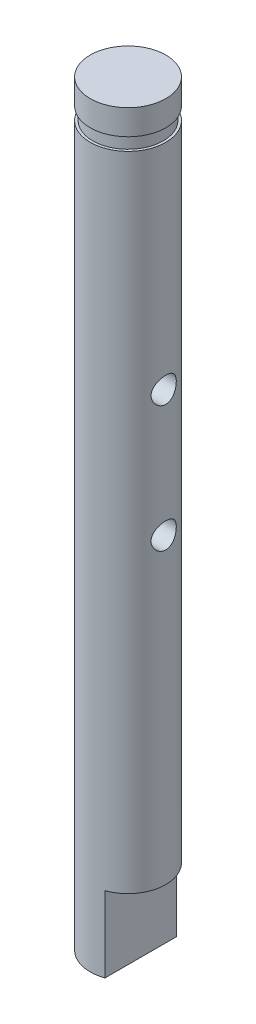
ISO-10303-21;
HEADER;
FILE_DESCRIPTION(('STEP AP214'),'2;1');
FILE_NAME('part.step','',(''),(''),'','','');
FILE_SCHEMA(('AUTOMOTIVE_DESIGN { 1 0 10303 214 1 1 1 1 }'));
ENDSEC;
DATA;
#1=APPLICATION_CONTEXT('core data for automotive mechanical design processes');
#2=APPLICATION_PROTOCOL_DEFINITION('international standard','automotive_design',2000,#1);
#3=PRODUCT_CONTEXT('',#1,'mechanical');
#4=PRODUCT('Part','Part','',(#3));
#5=PRODUCT_RELATED_PRODUCT_CATEGORY('part','',(#4));
#6=PRODUCT_DEFINITION_FORMATION('','',#4);
#7=PRODUCT_DEFINITION_CONTEXT('part definition',#1,'design');
#8=PRODUCT_DEFINITION('design','',#6,#7);
#9=PRODUCT_DEFINITION_SHAPE('','',#8);
#10=(LENGTH_UNIT() NAMED_UNIT(*) SI_UNIT(.MILLI.,.METRE.));
#11=(NAMED_UNIT(*) PLANE_ANGLE_UNIT() SI_UNIT($,.RADIAN.));
#12=(NAMED_UNIT(*) SI_UNIT($,.STERADIAN.) SOLID_ANGLE_UNIT());
#13=UNCERTAINTY_MEASURE_WITH_UNIT(LENGTH_MEASURE(1.E-05),#10,'distance_accuracy_value','');
#14=(GEOMETRIC_REPRESENTATION_CONTEXT(3) GLOBAL_UNCERTAINTY_ASSIGNED_CONTEXT((#13)) GLOBAL_UNIT_ASSIGNED_CONTEXT((#10,
#11,#12)) REPRESENTATION_CONTEXT('',''));
#15=CARTESIAN_POINT('',(0.,0.,0.));
#16=DIRECTION('',(0.,0.,1.));
#17=DIRECTION('',(1.,0.,0.));
#18=AXIS2_PLACEMENT_3D('',#15,#16,#17);
#19=CARTESIAN_POINT('',(0.,0.,0.));
#20=DIRECTION('',(0.,1.,0.));
#21=DIRECTION('',(0.,0.,1.));
#22=AXIS2_PLACEMENT_3D('',#19,#20,#21);
#23=PLANE('',#22);
#24=DIRECTION('',(0.,0.,-1.));
#25=VECTOR('',#24,1.);
#26=CARTESIAN_POINT('',(1.,0.,2.82842712474619));
#27=LINE('',#26,#25);
#28=CARTESIAN_POINT('',(1.,0.,2.82842712474619));
#29=VERTEX_POINT('',#28);
#30=CARTESIAN_POINT('',(1.,0.,-2.82842712474619));
#31=VERTEX_POINT('',#30);
#32=EDGE_CURVE('E76',#29,#31,#27,.T.);
#33=ORIENTED_EDGE('',*,*,#32,.F.);
#34=CARTESIAN_POINT('',(0.,0.,0.));
#35=DIRECTION('',(0.,1.,0.));
#36=DIRECTION('',(0.,0.,1.));
#37=AXIS2_PLACEMENT_3D('',#34,#35,#36);
#38=CIRCLE('',#37,3.);
#39=EDGE_CURVE('E86',#31,#29,#38,.T.);
#40=ORIENTED_EDGE('',*,*,#39,.F.);
#41=EDGE_LOOP('',(#33,#40));
#42=FACE_BOUND('',#41,.T.);
#43=ADVANCED_FACE('F42',(#42),#23,.F.);
#44=CARTESIAN_POINT('',(0.,60.,0.));
#45=DIRECTION('',(0.,-1.,0.));
#46=DIRECTION('',(0.,0.,-1.));
#47=AXIS2_PLACEMENT_3D('',#44,#45,#46);
#48=CYLINDRICAL_SURFACE('',#47,3.);
#49=CARTESIAN_POINT('',(0.,6.,0.));
#50=DIRECTION('',(0.,-1.,0.));
#51=DIRECTION('',(0.,0.,-1.));
#52=AXIS2_PLACEMENT_3D('',#49,#50,#51);
#53=CIRCLE('',#52,3.);
#54=CARTESIAN_POINT('',(1.,6.,-2.82842712474619));
#55=VERTEX_POINT('',#54);
#56=CARTESIAN_POINT('',(1.,6.,2.82842712474619));
#57=VERTEX_POINT('',#56);
#58=EDGE_CURVE('E68',#55,#57,#53,.T.);
#59=ORIENTED_EDGE('',*,*,#58,.F.);
#60=DIRECTION('',(0.,-1.,0.));
#61=VECTOR('',#60,1.);
#62=CARTESIAN_POINT('',(1.,6.,-2.82842712474619));
#63=LINE('',#62,#61);
#64=EDGE_CURVE('E83',#55,#31,#63,.T.);
#65=ORIENTED_EDGE('',*,*,#64,.T.);
#66=ORIENTED_EDGE('',*,*,#39,.T.);
#67=DIRECTION('',(0.,-1.,0.));
#68=VECTOR('',#67,1.);
#69=CARTESIAN_POINT('',(1.,6.,2.82842712474619));
#70=LINE('',#69,#68);
#71=EDGE_CURVE('E77',#57,#29,#70,.T.);
#72=ORIENTED_EDGE('',*,*,#71,.F.);
#73=EDGE_LOOP('',(#59,#65,#66,#72));
#74=FACE_BOUND('',#73,.T.);
#75=CARTESIAN_POINT('',(-3.,39.,0.));
#76=CARTESIAN_POINT('',(-3.00000015300943,38.9999997462684,-0.0545633628867233));
#77=CARTESIAN_POINT('',(-2.99849769507545,39.0044802661272,-0.10912519453855));
#78=CARTESIAN_POINT('',(-2.99265210203281,39.0222291088172,-0.216641760872972));
#79=CARTESIAN_POINT('',(-2.98830867202153,39.0354983439489,-0.269596328118819));
#80=CARTESIAN_POINT('',(-2.97725307906443,39.070319243384,-0.372332789501776));
#81=CARTESIAN_POINT('',(-2.97054487730853,39.0918570624593,-0.422119825886033));
#82=CARTESIAN_POINT('',(-2.95544445717342,39.1425411728383,-0.517374936805323));
#83=CARTESIAN_POINT('',(-2.94705190667778,39.1716889650026,-0.562842156958705));
#84=CARTESIAN_POINT('',(-2.92914094443005,39.2378258048587,-0.649741675022267));
#85=CARTESIAN_POINT('',(-2.91959556463785,39.2750312342605,-0.69100370029831));
#86=CARTESIAN_POINT('',(-2.90060314783121,39.3557671547066,-0.766832692702085));
#87=CARTESIAN_POINT('',(-2.89115613290549,39.3992990349285,-0.801398185489463));
#88=CARTESIAN_POINT('',(-2.87313332477274,39.4929851151965,-0.863824942227859));
#89=CARTESIAN_POINT('',(-2.86459039275688,39.5432937397321,-0.891464858221032));
#90=CARTESIAN_POINT('',(-2.84975305418601,39.6481760944585,-0.937818873877723));
#91=CARTESIAN_POINT('',(-2.84345796160746,39.7027485171627,-0.956535697386767));
#92=CARTESIAN_POINT('',(-2.83411303269377,39.8126732214967,-0.983873461509167));
#93=CARTESIAN_POINT('',(-2.83096095769611,39.8679372084891,-0.992813448271772));
#94=CARTESIAN_POINT('',(-2.82795656629508,39.9792637541559,-1.00134112333448));
#95=CARTESIAN_POINT('',(-2.8281032302273,40.0353260607092,-1.00093170160472));
#96=CARTESIAN_POINT('',(-2.8315901500818,40.143936630444,-0.99101990370342));
#97=CARTESIAN_POINT('',(-2.83478415867533,40.196528402919,-0.981933913166996));
#98=CARTESIAN_POINT('',(-2.84376657724551,40.2993934196068,-0.955606162849418));
#99=CARTESIAN_POINT('',(-2.84955529784108,40.3496663854351,-0.938363426591872));
#100=CARTESIAN_POINT('',(-2.86317911131249,40.4474127495915,-0.895939058060213));
#101=CARTESIAN_POINT('',(-2.87104565793117,40.4948280254695,-0.870634048707265));
#102=CARTESIAN_POINT('',(-2.88792558575726,40.5848709082797,-0.812889106303141));
#103=CARTESIAN_POINT('',(-2.89693929790464,40.6274971269334,-0.780447112364007));
#104=CARTESIAN_POINT('',(-2.91567329167741,40.7090915981608,-0.707349332682237));
#105=CARTESIAN_POINT('',(-2.92540589354843,40.7477526945091,-0.66635315007631));
#106=CARTESIAN_POINT('',(-2.94406938387037,40.8177312666634,-0.578339569970061));
#107=CARTESIAN_POINT('',(-2.95300019538067,40.8490480381645,-0.531321595660813));
#108=CARTESIAN_POINT('',(-2.96917107937794,40.9036963002351,-0.431947613046268));
#109=CARTESIAN_POINT('',(-2.97639350008039,40.9269454913407,-0.379543276416337));
#110=CARTESIAN_POINT('',(-2.98820567144435,40.9642031739557,-0.271269083364509));
#111=CARTESIAN_POINT('',(-2.99279633654879,40.9782148754234,-0.215400438154955));
#112=CARTESIAN_POINT('',(-2.99867627071441,40.9960556660224,-0.104383829529304));
#113=CARTESIAN_POINT('',(-3.00010001833731,41.0002998091727,-0.0493095998648457));
#114=CARTESIAN_POINT('',(-2.99988902694825,40.9996673264015,0.0607750699602366));
#115=CARTESIAN_POINT('',(-2.99825480419352,40.9947922400201,0.115785519319648));
#116=CARTESIAN_POINT('',(-2.99220024717114,40.976388092264,0.222519866304259));
#117=CARTESIAN_POINT('',(-2.98786198711228,40.9631137939505,0.274292806834855));
#118=CARTESIAN_POINT('',(-2.97691846830034,40.9286065555333,0.37485595857956));
#119=CARTESIAN_POINT('',(-2.97031292046541,40.9073726005323,0.423645788508559));
#120=CARTESIAN_POINT('',(-2.95528931287427,40.8569295681591,0.518288296393323));
#121=CARTESIAN_POINT('',(-2.94682814756305,40.8275254067164,0.564029959217331));
#122=CARTESIAN_POINT('',(-2.92905253915743,40.7618058499869,0.650064830135405));
#123=CARTESIAN_POINT('',(-2.91973783591888,40.7254883439698,0.690356367794895));
#124=CARTESIAN_POINT('',(-2.90076847982472,40.6450212489917,0.766252507807013));
#125=CARTESIAN_POINT('',(-2.89111761095155,40.6005907730667,0.801560969248491));
#126=CARTESIAN_POINT('',(-2.87299973286981,40.5062284321955,0.864257522320853));
#127=CARTESIAN_POINT('',(-2.8645327335312,40.4562965213898,0.891645547920842));
#128=CARTESIAN_POINT('',(-2.84982391820308,40.3523269846934,0.93759693042336));
#129=CARTESIAN_POINT('',(-2.84357760900632,40.2982979207572,0.956178132197766));
#130=CARTESIAN_POINT('',(-2.83410832399133,40.1876213498758,0.983894666792163));
#131=CARTESIAN_POINT('',(-2.83088398622698,40.1309750345669,0.993034254961245));
#132=CARTESIAN_POINT('',(-2.82797858875071,40.0198029039868,1.00127628247038));
#133=CARTESIAN_POINT('',(-2.82812400344299,39.9653176597483,1.00087025731093));
#134=CARTESIAN_POINT('',(-2.8315126992356,39.8572349251003,0.99124229345488));
#135=CARTESIAN_POINT('',(-2.83475579595884,39.8036373820471,0.982020879458889));
#136=CARTESIAN_POINT('',(-2.84384524278943,39.6998643369873,0.955371813126983));
#137=CARTESIAN_POINT('',(-2.84964098015514,39.6496431749928,0.938103346014883));
#138=CARTESIAN_POINT('',(-2.86316398825434,39.5527725930645,0.895979365760383));
#139=CARTESIAN_POINT('',(-2.87089168765297,39.5061239688127,0.871122168553977));
#140=CARTESIAN_POINT('',(-2.8878282922406,39.4155163300763,0.813260692583244));
#141=CARTESIAN_POINT('',(-2.89708711641604,39.3717634981014,0.779948242764529));
#142=CARTESIAN_POINT('',(-2.91583356283786,39.290310186616,0.706642883135695));
#143=CARTESIAN_POINT('',(-2.92532124912518,39.252611424312,0.666648084451492));
#144=CARTESIAN_POINT('',(-2.94390030525393,39.1828555877108,0.579241556920673));
#145=CARTESIAN_POINT('',(-2.95296181801216,39.151075652249,0.531601513499725));
#146=CARTESIAN_POINT('',(-2.96925991172652,39.0960095711494,0.431357357406629));
#147=CARTESIAN_POINT('',(-2.9764969590794,39.0727212540779,0.37875451813235));
#148=CARTESIAN_POINT('',(-2.98805515068532,39.0362783675113,0.272493647200975));
#149=CARTESIAN_POINT('',(-2.9924921242252,39.0227175337366,0.218987757676409));
#150=CARTESIAN_POINT('',(-2.99846407064224,39.0045797193229,0.110320416010248));
#151=CARTESIAN_POINT('',(-2.99999984531906,39.0000002565035,0.0551594255687465));
#152=CARTESIAN_POINT('',(-3.,39.,0.));
#153=B_SPLINE_CURVE_WITH_KNOTS('',3,(#75,#76,#77,#78,#79,#80,#81,#82,#83,#84,#85,#86,#87,#88,
#89,#90,#91,#92,#93,#94,#95,#96,#97,#98,#99,#100,#101,#102,#103,#104,#105,#106,#107,#108,#109,
#110,#111,#112,#113,#114,#115,#116,#117,#118,#119,#120,#121,#122,#123,#124,#125,#126,#127,#128,
#129,#130,#131,#132,#133,#134,#135,#136,#137,#138,#139,#140,#141,#142,#143,#144,#145,#146,#147,
#148,#149,#150,#151,#152),.UNSPECIFIED.,.T.,.F.,(4,2,2,2,2,2,2,2,2,2,2,2,2,2,2,2,2,2,2,2,2,2,2,
2,2,2,2,2,2,2,2,2,2,2,2,2,2,2,4),(0.,0.163487106026011,0.326991185267521,0.490222672870272,
0.6534863777991,0.821846842827559,0.990244332875301,1.16348384823471,1.33667044692834,
1.50401925741842,1.67131633987487,1.83096826551281,1.99063930855482,2.15288171155131,
2.31517102558208,2.48593305811368,2.65671145966619,2.82918405650358,3.00159668877209,
3.1665358317517,3.33144713164177,3.49158157978214,3.65173645284105,3.81610399843737,
3.98052180821892,4.15241022880752,4.32430008234997,4.49584013824417,4.66730284700846,
4.82995666056619,4.99260079341185,5.15215587070228,5.31174638165789,5.47830066681616,
5.6449021111359,5.81799660824912,5.99104681142267,6.15636558363625,6.32163866027951),.UNSPECIFIED.);
#154=CARTESIAN_POINT('',(-3.,39.,0.));
#155=VERTEX_POINT('',#154);
#156=EDGE_CURVE('E11',#155,#155,#153,.T.);
#157=ORIENTED_EDGE('',*,*,#156,.T.);
#158=EDGE_LOOP('',(#157));
#159=FACE_BOUND('',#158,.T.);
#160=CARTESIAN_POINT('',(2.82842712474619,40.,-1.));
#161=CARTESIAN_POINT('',(2.82842694532735,39.9455318251893,-1.0000002579478));
#162=CARTESIAN_POINT('',(2.83001769372806,39.8910652002285,-0.995534783698142));
#163=CARTESIAN_POINT('',(2.8361757417458,39.7837455790494,-0.977851131702565));
#164=CARTESIAN_POINT('',(2.8407435316722,39.7308928501361,-0.964631512170675));
#165=CARTESIAN_POINT('',(2.85228203663888,39.6283731069872,-0.929955485680264));
#166=CARTESIAN_POINT('',(2.8592480396464,39.5787000705531,-0.908515221402002));
#167=CARTESIAN_POINT('',(2.87479122017008,39.4836399514562,-0.858061628442629));
#168=CARTESIAN_POINT('',(2.88336875305432,39.4382538174475,-0.829046628860525));
#169=CARTESIAN_POINT('',(2.90154489405589,39.3512800376605,-0.763051146442529));
#170=CARTESIAN_POINT('',(2.91116894844139,39.309884571328,-0.725824341377828));
#171=CARTESIAN_POINT('',(2.93013864801508,39.2337931987757,-0.644987667214493));
#172=CARTESIAN_POINT('',(2.93948424829099,39.1990983684177,-0.601376775052404));
#173=CARTESIAN_POINT('',(2.95713866921658,39.1365211026703,-0.507604507964987));
#174=CARTESIAN_POINT('',(2.96541407701568,39.108840029382,-0.457301911224522));
#175=CARTESIAN_POINT('',(2.9796958677102,39.0624084148725,-0.352431222987485));
#176=CARTESIAN_POINT('',(2.98570286203012,39.0436554668231,-0.297864285687217));
#177=CARTESIAN_POINT('',(2.99459075431897,39.0162641453676,-0.188028817433495));
#178=CARTESIAN_POINT('',(2.99757314777558,39.007296553743,-0.13285075485297));
#179=CARTESIAN_POINT('',(3.00043608218249,38.9986837066393,-0.0216978748240929));
#180=CARTESIAN_POINT('',(3.00031742262891,38.9990360483476,0.0342767335438913));
#181=CARTESIAN_POINT('',(2.99706039618736,39.008844254566,0.143103515193816));
#182=CARTESIAN_POINT('',(2.99404064755135,39.0179425284745,0.195992048591665));
#183=CARTESIAN_POINT('',(2.98546967339714,39.0443929809804,0.299443438822159));
#184=CARTESIAN_POINT('',(2.97991827631115,39.0617457189797,0.350006137779174));
#185=CARTESIAN_POINT('',(2.96675670293292,39.1044213173061,0.448152474842012));
#186=CARTESIAN_POINT('',(2.9591204252427,39.1298459385468,0.495688220968997));
#187=CARTESIAN_POINT('',(2.94258393038665,39.1878597054484,0.585924325527168));
#188=CARTESIAN_POINT('',(2.93368336200518,39.2204508433266,0.628623334384768));
#189=CARTESIAN_POINT('',(2.9150619185089,39.2936743934607,0.710100866551905));
#190=CARTESIAN_POINT('',(2.90532215172667,39.3346131578454,0.748600157067554));
#191=CARTESIAN_POINT('',(2.88647335245111,39.4224487257226,0.818277259595888));
#192=CARTESIAN_POINT('',(2.8773644173145,39.4693464457132,0.849453943273003));
#193=CARTESIAN_POINT('',(2.86070525135531,39.5686536256154,0.903987455042733));
#194=CARTESIAN_POINT('',(2.85317909338821,39.6211321313678,0.927226463651051));
#195=CARTESIAN_POINT('',(2.84081650878299,39.7295713942663,0.964443193299509));
#196=CARTESIAN_POINT('',(2.83597895501223,39.7855306812218,0.978424795755531));
#197=CARTESIAN_POINT('',(2.8297963630207,39.8966383554006,0.996161282090476));
#198=CARTESIAN_POINT('',(2.82830360315139,39.9517094247457,1.00034909550575));
#199=CARTESIAN_POINT('',(2.828566720628,40.061776149117,0.999605438911605));
#200=CARTESIAN_POINT('',(2.83032200792768,40.1167718160248,0.994675625227261));
#201=CARTESIAN_POINT('',(2.83673618089379,40.2231569657112,0.976225651551831));
#202=CARTESIAN_POINT('',(2.84129325440593,40.2746054301506,0.963006393980555));
#203=CARTESIAN_POINT('',(2.8526855367127,40.3745436062394,0.928713862560596));
#204=CARTESIAN_POINT('',(2.85952114934907,40.4230327915908,0.907639196363458));
#205=CARTESIAN_POINT('',(2.87496877595718,40.5173804208469,0.857474340738902));
#206=CARTESIAN_POINT('',(2.8836302566561,40.5631066426418,0.828151118358489));
#207=CARTESIAN_POINT('',(2.90165768730984,40.6491460523837,0.76258563055757));
#208=CARTESIAN_POINT('',(2.91102384443799,40.6894576386612,0.726341325498787));
#209=CARTESIAN_POINT('',(2.92995038637844,40.7655279840906,0.645891705900326));
#210=CARTESIAN_POINT('',(2.93949843577895,40.8009743900188,0.601387270546654));
#211=CARTESIAN_POINT('',(2.9572685161311,40.863916142348,0.506827291400261));
#212=CARTESIAN_POINT('',(2.96549059417695,40.8914117711624,0.456771944864557));
#213=CARTESIAN_POINT('',(2.97964405810603,40.9374201048617,0.3527798624323));
#214=CARTESIAN_POINT('',(2.98559030004531,40.9559912771481,0.298871123321199));
#215=CARTESIAN_POINT('',(2.99458610837774,40.9837277420601,0.188458465846019));
#216=CARTESIAN_POINT('',(2.99763672034018,40.9928964298805,0.131955491953892));
#217=CARTESIAN_POINT('',(3.00041863236257,41.0012620776056,0.0208153358600432));
#218=CARTESIAN_POINT('',(3.00029920089441,41.0009074539324,-0.033784723920017));
#219=CARTESIAN_POINT('',(2.99712196519396,40.9913426918536,-0.142111145000172));
#220=CARTESIAN_POINT('',(2.99406439933567,40.9821332718472,-0.195837576819054));
#221=CARTESIAN_POINT('',(2.98540914954421,40.955417765424,-0.300042119432059));
#222=CARTESIAN_POINT('',(2.9798525836118,40.938045784647,-0.350558270912794));
#223=CARTESIAN_POINT('',(2.96677160704464,40.8956224689029,-0.447978350939788));
#224=CARTESIAN_POINT('',(2.95924684047901,40.870569744803,-0.494881624142409));
#225=CARTESIAN_POINT('',(2.94265868828001,40.8124304878979,-0.585634016308807));
#226=CARTESIAN_POINT('',(2.93354872492381,40.7790813146181,-0.629306251557694));
#227=CARTESIAN_POINT('',(2.91492988791425,40.7057426088441,-0.710581026272336));
#228=CARTESIAN_POINT('',(2.90542088771397,40.6657509577383,-0.748181621624257));
#229=CARTESIAN_POINT('',(2.88663279827365,40.578390644412,-0.817741808833463));
#230=CARTESIAN_POINT('',(2.87737727995345,40.5307944890192,-0.849422965999216));
#231=CARTESIAN_POINT('',(2.86060193316303,40.4306655731013,-0.9043143432998));
#232=CARTESIAN_POINT('',(2.8530816513617,40.3781341069857,-0.92752677681456));
#233=CARTESIAN_POINT('',(2.84101334230535,40.2720381759762,-0.963843828206628));
#234=CARTESIAN_POINT('',(2.83634632944799,40.2186277364343,-0.977357909163269));
#235=CARTESIAN_POINT('',(2.83005383613939,40.1101439494845,-0.995434320161695));
#236=CARTESIAN_POINT('',(2.82842730615135,40.0550711825642,-0.999999739196503));
#237=CARTESIAN_POINT('',(2.82842712474619,40.,-1.));
#238=B_SPLINE_CURVE_WITH_KNOTS('',3,(#160,#161,#162,#163,#164,#165,#166,#167,#168,#169,#170,
#171,#172,#173,#174,#175,#176,#177,#178,#179,#180,#181,#182,#183,#184,#185,#186,#187,#188,#189,
#190,#191,#192,#193,#194,#195,#196,#197,#198,#199,#200,#201,#202,#203,#204,#205,#206,#207,#208,
#209,#210,#211,#212,#213,#214,#215,#216,#217,#218,#219,#220,#221,#222,#223,#224,#225,#226,#227,
#228,#229,#230,#231,#232,#233,#234,#235,#236,#237),.UNSPECIFIED.,.T.,.F.,(4,2,2,2,2,2,2,2,2,2,2,
2,2,2,2,2,2,2,2,2,2,2,2,2,2,2,2,2,2,2,2,2,2,2,2,2,2,2,4),(0.,0.163200584775419,
0.326428054968878,0.489336627454543,0.65228116613916,0.821013374229392,0.989772651673594,
1.16293506139029,1.33605076382161,1.50314318760306,1.67019253297699,1.83069004820941,
1.99119844184608,2.15381654855707,2.31647991869394,2.48680174359289,2.65714979607477,
2.82992639837377,3.00263051349689,3.16754291357514,3.33242535830307,3.49164395761849,
3.65089079140019,3.81518857728788,3.979534856552,4.15178808164165,4.32403518750605,
4.49513791183925,4.6661788299723,4.82918084670709,4.99216964002854,5.15256956033503,
5.31299850756316,5.47935519513707,5.64576504425705,5.81868902729218,5.9915677825994,
6.15663212153687,6.3216394717923),.UNSPECIFIED.);
#239=CARTESIAN_POINT('',(2.82842712474619,40.,-1.));
#240=VERTEX_POINT('',#239);
#241=EDGE_CURVE('E59',#240,#240,#238,.T.);
#242=ORIENTED_EDGE('',*,*,#241,.T.);
#243=EDGE_LOOP('',(#242));
#244=FACE_BOUND('',#243,.T.);
#245=CARTESIAN_POINT('',(-3.,29.,0.));
#246=CARTESIAN_POINT('',(-3.00000015300943,28.9999997462684,-0.0545633628867236));
#247=CARTESIAN_POINT('',(-2.99849769507545,29.0044802661272,-0.109125194538551));
#248=CARTESIAN_POINT('',(-2.99265210203281,29.0222291088172,-0.216641760872973));
#249=CARTESIAN_POINT('',(-2.98830867202153,29.0354983439489,-0.269596328118818));
#250=CARTESIAN_POINT('',(-2.97725307906443,29.070319243384,-0.372332789501777));
#251=CARTESIAN_POINT('',(-2.97054487730853,29.0918570624593,-0.422119825886037));
#252=CARTESIAN_POINT('',(-2.95544445717342,29.1425411728383,-0.517374936805327));
#253=CARTESIAN_POINT('',(-2.94705190667778,29.1716889650026,-0.562842156958707));
#254=CARTESIAN_POINT('',(-2.92914094443005,29.2378258048587,-0.649741675022267));
#255=CARTESIAN_POINT('',(-2.91959556463785,29.2750312342605,-0.69100370029831));
#256=CARTESIAN_POINT('',(-2.90060314783122,29.3557671547066,-0.766832692702085));
#257=CARTESIAN_POINT('',(-2.89115613290549,29.3992990349285,-0.801398185489464));
#258=CARTESIAN_POINT('',(-2.87313332477274,29.4929851151965,-0.86382494222786));
#259=CARTESIAN_POINT('',(-2.86459039275688,29.5432937397321,-0.891464858221034));
#260=CARTESIAN_POINT('',(-2.84975305418601,29.6481760944585,-0.937818873877723));
#261=CARTESIAN_POINT('',(-2.84345796160746,29.7027485171627,-0.956535697386767));
#262=CARTESIAN_POINT('',(-2.83411303269377,29.8126732214967,-0.983873461509165));
#263=CARTESIAN_POINT('',(-2.83096095769611,29.8679372084891,-0.992813448271771));
#264=CARTESIAN_POINT('',(-2.82795656629508,29.9792637541559,-1.00134112333448));
#265=CARTESIAN_POINT('',(-2.8281032302273,30.0353260607092,-1.00093170160472));
#266=CARTESIAN_POINT('',(-2.8315901500818,30.143936630444,-0.991019903703419));
#267=CARTESIAN_POINT('',(-2.83478415867533,30.196528402919,-0.981933913166995));
#268=CARTESIAN_POINT('',(-2.84376657724551,30.2993934196068,-0.955606162849417));
#269=CARTESIAN_POINT('',(-2.84955529784108,30.3496663854351,-0.93836342659187));
#270=CARTESIAN_POINT('',(-2.86317911131249,30.4474127495915,-0.89593905806021));
#271=CARTESIAN_POINT('',(-2.87104565793117,30.4948280254695,-0.870634048707261));
#272=CARTESIAN_POINT('',(-2.88792558575726,30.5848709082797,-0.812889106303137));
#273=CARTESIAN_POINT('',(-2.89693929790464,30.6274971269334,-0.780447112364003));
#274=CARTESIAN_POINT('',(-2.91567329167741,30.7090915981608,-0.707349332682236));
#275=CARTESIAN_POINT('',(-2.92540589354843,30.7477526945091,-0.66635315007631));
#276=CARTESIAN_POINT('',(-2.94406938387037,30.8177312666634,-0.578339569970064));
#277=CARTESIAN_POINT('',(-2.95300019538067,30.8490480381645,-0.531321595660814));
#278=CARTESIAN_POINT('',(-2.96917107937794,30.9036963002351,-0.431947613046268));
#279=CARTESIAN_POINT('',(-2.97639350008039,30.9269454913407,-0.379543276416337));
#280=CARTESIAN_POINT('',(-2.98820567144435,30.9642031739557,-0.271269083364508));
#281=CARTESIAN_POINT('',(-2.99279633654879,30.9782148754234,-0.215400438154953));
#282=CARTESIAN_POINT('',(-2.99867627071441,30.9960556660224,-0.104383829529302));
#283=CARTESIAN_POINT('',(-3.00010001833731,31.0002998091727,-0.0493095998648441));
#284=CARTESIAN_POINT('',(-2.99988902694825,30.9996673264015,0.0607750699602373));
#285=CARTESIAN_POINT('',(-2.99825480419352,30.9947922400201,0.115785519319648));
#286=CARTESIAN_POINT('',(-2.99220024717114,30.976388092264,0.22251986630426));
#287=CARTESIAN_POINT('',(-2.98786198711228,30.9631137939505,0.274292806834857));
#288=CARTESIAN_POINT('',(-2.97691846830034,30.9286065555333,0.374855958579562));
#289=CARTESIAN_POINT('',(-2.97031292046541,30.9073726005323,0.423645788508561));
#290=CARTESIAN_POINT('',(-2.95528931287427,30.8569295681591,0.518288296393323));
#291=CARTESIAN_POINT('',(-2.94682814756305,30.8275254067164,0.564029959217331));
#292=CARTESIAN_POINT('',(-2.92905253915743,30.7618058499869,0.650064830135406));
#293=CARTESIAN_POINT('',(-2.91973783591888,30.7254883439698,0.690356367794895));
#294=CARTESIAN_POINT('',(-2.90076847982472,30.6450212489917,0.766252507807013));
#295=CARTESIAN_POINT('',(-2.89111761095155,30.6005907730667,0.801560969248491));
#296=CARTESIAN_POINT('',(-2.87299973286981,30.5062284321955,0.864257522320854));
#297=CARTESIAN_POINT('',(-2.8645327335312,30.4562965213898,0.891645547920844));
#298=CARTESIAN_POINT('',(-2.84982391820308,30.3523269846934,0.937596930423361));
#299=CARTESIAN_POINT('',(-2.84357760900632,30.2982979207572,0.956178132197766));
#300=CARTESIAN_POINT('',(-2.83410832399133,30.1876213498758,0.983894666792162));
#301=CARTESIAN_POINT('',(-2.83088398622698,30.1309750345669,0.993034254961244));
#302=CARTESIAN_POINT('',(-2.82797858875071,30.0198029039868,1.00127628247038));
#303=CARTESIAN_POINT('',(-2.82812400344299,29.9653176597483,1.00087025731093));
#304=CARTESIAN_POINT('',(-2.8315126992356,29.8572349251002,0.991242293454878));
#305=CARTESIAN_POINT('',(-2.83475579595884,29.8036373820471,0.982020879458887));
#306=CARTESIAN_POINT('',(-2.84384524278943,29.6998643369873,0.95537181312698));
#307=CARTESIAN_POINT('',(-2.84964098015514,29.6496431749928,0.93810334601488));
#308=CARTESIAN_POINT('',(-2.86316398825434,29.5527725930645,0.895979365760382));
#309=CARTESIAN_POINT('',(-2.87089168765297,29.5061239688127,0.87112216855398));
#310=CARTESIAN_POINT('',(-2.8878282922406,29.4155163300763,0.813260692583251));
#311=CARTESIAN_POINT('',(-2.89708711641604,29.3717634981014,0.779948242764535));
#312=CARTESIAN_POINT('',(-2.91583356283786,29.290310186616,0.7066428831357));
#313=CARTESIAN_POINT('',(-2.92532124912518,29.252611424312,0.666648084451498));
#314=CARTESIAN_POINT('',(-2.94390030525393,29.1828555877108,0.579241556920676));
#315=CARTESIAN_POINT('',(-2.95296181801216,29.151075652249,0.531601513499726));
#316=CARTESIAN_POINT('',(-2.96925991172652,29.0960095711494,0.431357357406628));
#317=CARTESIAN_POINT('',(-2.9764969590794,29.072721254078,0.378754518132348));
#318=CARTESIAN_POINT('',(-2.98805515068532,29.0362783675113,0.272493647200973));
#319=CARTESIAN_POINT('',(-2.9924921242252,29.0227175337366,0.218987757676407));
#320=CARTESIAN_POINT('',(-2.99846407064225,29.0045797193229,0.110320416010247));
#321=CARTESIAN_POINT('',(-2.99999984531906,29.0000002565035,0.0551594255687461));
#322=CARTESIAN_POINT('',(-3.,29.,0.));
#323=B_SPLINE_CURVE_WITH_KNOTS('',3,(#245,#246,#247,#248,#249,#250,#251,#252,#253,#254,#255,
#256,#257,#258,#259,#260,#261,#262,#263,#264,#265,#266,#267,#268,#269,#270,#271,#272,#273,#274,
#275,#276,#277,#278,#279,#280,#281,#282,#283,#284,#285,#286,#287,#288,#289,#290,#291,#292,#293,
#294,#295,#296,#297,#298,#299,#300,#301,#302,#303,#304,#305,#306,#307,#308,#309,#310,#311,#312,
#313,#314,#315,#316,#317,#318,#319,#320,#321,#322),.UNSPECIFIED.,.T.,.F.,(4,2,2,2,2,2,2,2,2,2,2,
2,2,2,2,2,2,2,2,2,2,2,2,2,2,2,2,2,2,2,2,2,2,2,2,2,2,2,4),(0.,0.163487106026012,
0.326991185267522,0.490222672870278,0.653486377799101,0.821846842827561,0.990244332875304,
1.16348384823471,1.33667044692834,1.5040192574184,1.67131633987486,1.83096826551281,
1.99063930855483,2.15288171155131,2.31517102558208,2.48593305811367,2.65671145966618,
2.82918405650358,3.00159668877209,3.1665358317517,3.33144713164177,3.49158157978214,
3.65173645284104,3.81610399843737,3.98052180821892,4.15241022880751,4.32430008234997,
4.49584013824416,4.66730284700846,4.82995666056619,4.99260079341186,5.15215587070228,
5.31174638165788,5.47830066681614,5.64490211113589,5.81799660824911,5.99104681142267,
6.15636558363624,6.3216386602795),.UNSPECIFIED.);
#324=CARTESIAN_POINT('',(-3.,29.,0.));
#325=VERTEX_POINT('',#324);
#326=EDGE_CURVE('E119',#325,#325,#323,.T.);
#327=ORIENTED_EDGE('',*,*,#326,.T.);
#328=EDGE_LOOP('',(#327));
#329=FACE_BOUND('',#328,.T.);
#330=CARTESIAN_POINT('',(2.82842712474619,30.,-1.));
#331=CARTESIAN_POINT('',(2.82842694532735,29.9455318251893,-1.0000002579478));
#332=CARTESIAN_POINT('',(2.83001769372806,29.8910652002285,-0.995534783698141));
#333=CARTESIAN_POINT('',(2.8361757417458,29.7837455790494,-0.977851131702565));
#334=CARTESIAN_POINT('',(2.8407435316722,29.7308928501361,-0.964631512170674));
#335=CARTESIAN_POINT('',(2.85228203663888,29.6283731069872,-0.929955485680263));
#336=CARTESIAN_POINT('',(2.8592480396464,29.5787000705531,-0.908515221402));
#337=CARTESIAN_POINT('',(2.87479122017008,29.4836399514562,-0.858061628442628));
#338=CARTESIAN_POINT('',(2.88336875305432,29.4382538174475,-0.829046628860524));
#339=CARTESIAN_POINT('',(2.90154489405589,29.3512800376605,-0.763051146442528));
#340=CARTESIAN_POINT('',(2.91116894844139,29.3098845713279,-0.725824341377825));
#341=CARTESIAN_POINT('',(2.93013864801508,29.2337931987757,-0.644987667214489));
#342=CARTESIAN_POINT('',(2.93948424829099,29.1990983684177,-0.601376775052401));
#343=CARTESIAN_POINT('',(2.95713866921658,29.1365211026703,-0.507604507964984));
#344=CARTESIAN_POINT('',(2.96541407701568,29.108840029382,-0.457301911224518));
#345=CARTESIAN_POINT('',(2.97969586771021,29.0624084148725,-0.35243122298748));
#346=CARTESIAN_POINT('',(2.98570286203012,29.0436554668231,-0.297864285687213));
#347=CARTESIAN_POINT('',(2.99459075431897,29.0162641453676,-0.188028817433491));
#348=CARTESIAN_POINT('',(2.99757314777558,29.007296553743,-0.132850754852966));
#349=CARTESIAN_POINT('',(3.00043608218249,28.9986837066393,-0.0216978748240895));
#350=CARTESIAN_POINT('',(3.00031742262891,28.9990360483476,0.0342767335438945));
#351=CARTESIAN_POINT('',(2.99706039618736,29.008844254566,0.143103515193819));
#352=CARTESIAN_POINT('',(2.99404064755135,29.0179425284745,0.195992048591669));
#353=CARTESIAN_POINT('',(2.98546967339714,29.0443929809804,0.299443438822163));
#354=CARTESIAN_POINT('',(2.97991827631115,29.0617457189797,0.350006137779177));
#355=CARTESIAN_POINT('',(2.96675670293292,29.1044213173061,0.448152474842015));
#356=CARTESIAN_POINT('',(2.9591204252427,29.1298459385468,0.495688220969));
#357=CARTESIAN_POINT('',(2.94258393038665,29.1878597054484,0.585924325527171));
#358=CARTESIAN_POINT('',(2.93368336200518,29.2204508433266,0.628623334384772));
#359=CARTESIAN_POINT('',(2.9150619185089,29.2936743934607,0.710100866551909));
#360=CARTESIAN_POINT('',(2.90532215172667,29.3346131578454,0.748600157067558));
#361=CARTESIAN_POINT('',(2.88647335245111,29.4224487257226,0.818277259595891));
#362=CARTESIAN_POINT('',(2.8773644173145,29.4693464457132,0.849453943273006));
#363=CARTESIAN_POINT('',(2.86070525135531,29.5686536256154,0.903987455042733));
#364=CARTESIAN_POINT('',(2.85317909338821,29.6211321313678,0.927226463651051));
#365=CARTESIAN_POINT('',(2.84081650878299,29.7295713942663,0.964443193299508));
#366=CARTESIAN_POINT('',(2.83597895501223,29.7855306812218,0.978424795755531));
#367=CARTESIAN_POINT('',(2.8297963630207,29.8966383554006,0.996161282090475));
#368=CARTESIAN_POINT('',(2.82830360315139,29.9517094247457,1.00034909550575));
#369=CARTESIAN_POINT('',(2.828566720628,30.061776149117,0.999605438911605));
#370=CARTESIAN_POINT('',(2.83032200792768,30.1167718160248,0.99467562522726));
#371=CARTESIAN_POINT('',(2.83673618089379,30.2231569657112,0.97622565155183));
#372=CARTESIAN_POINT('',(2.84129325440593,30.2746054301506,0.963006393980555));
#373=CARTESIAN_POINT('',(2.8526855367127,30.3745436062394,0.928713862560596));
#374=CARTESIAN_POINT('',(2.85952114934907,30.4230327915908,0.907639196363458));
#375=CARTESIAN_POINT('',(2.87496877595718,30.5173804208469,0.857474340738902));
#376=CARTESIAN_POINT('',(2.8836302566561,30.5631066426418,0.828151118358488));
#377=CARTESIAN_POINT('',(2.90165768730984,30.6491460523837,0.762585630557568));
#378=CARTESIAN_POINT('',(2.91102384443799,30.6894576386612,0.726341325498784));
#379=CARTESIAN_POINT('',(2.92995038637844,30.7655279840906,0.645891705900322));
#380=CARTESIAN_POINT('',(2.93949843577895,30.8009743900188,0.60138727054665));
#381=CARTESIAN_POINT('',(2.9572685161311,30.863916142348,0.506827291400256));
#382=CARTESIAN_POINT('',(2.96549059417695,30.8914117711624,0.456771944864551));
#383=CARTESIAN_POINT('',(2.97964405810603,30.9374201048617,0.352779862432294));
#384=CARTESIAN_POINT('',(2.98559030004531,30.9559912771481,0.298871123321196));
#385=CARTESIAN_POINT('',(2.99458610837774,30.9837277420601,0.188458465846016));
#386=CARTESIAN_POINT('',(2.99763672034018,30.9928964298805,0.131955491953889));
#387=CARTESIAN_POINT('',(3.00041863236257,31.0012620776056,0.0208153358600402));
#388=CARTESIAN_POINT('',(3.00029920089442,31.0009074539324,-0.0337847239200193));
#389=CARTESIAN_POINT('',(2.99712196519396,30.9913426918536,-0.142111145000174));
#390=CARTESIAN_POINT('',(2.99406439933567,30.9821332718472,-0.195837576819056));
#391=CARTESIAN_POINT('',(2.98540914954421,30.955417765424,-0.300042119432062));
#392=CARTESIAN_POINT('',(2.9798525836118,30.938045784647,-0.350558270912797));
#393=CARTESIAN_POINT('',(2.96677160704464,30.8956224689029,-0.447978350939791));
#394=CARTESIAN_POINT('',(2.95924684047901,30.870569744803,-0.494881624142411));
#395=CARTESIAN_POINT('',(2.94265868828001,30.8124304878979,-0.585634016308811));
#396=CARTESIAN_POINT('',(2.93354872492381,30.7790813146181,-0.629306251557699));
#397=CARTESIAN_POINT('',(2.91492988791425,30.7057426088441,-0.710581026272341));
#398=CARTESIAN_POINT('',(2.90542088771397,30.6657509577383,-0.748181621624261));
#399=CARTESIAN_POINT('',(2.88663279827365,30.578390644412,-0.817741808833466));
#400=CARTESIAN_POINT('',(2.87737727995345,30.5307944890192,-0.849422965999219));
#401=CARTESIAN_POINT('',(2.86060193316303,30.4306655731013,-0.904314343299802));
#402=CARTESIAN_POINT('',(2.8530816513617,30.3781341069857,-0.927526776814561));
#403=CARTESIAN_POINT('',(2.84101334230535,30.2720381759762,-0.963843828206628));
#404=CARTESIAN_POINT('',(2.83634632944799,30.2186277364343,-0.977357909163269));
#405=CARTESIAN_POINT('',(2.83005383613939,30.1101439494845,-0.995434320161695));
#406=CARTESIAN_POINT('',(2.82842730615135,30.0550711825642,-0.999999739196503));
#407=CARTESIAN_POINT('',(2.82842712474619,30.,-1.));
#408=B_SPLINE_CURVE_WITH_KNOTS('',3,(#330,#331,#332,#333,#334,#335,#336,#337,#338,#339,#340,
#341,#342,#343,#344,#345,#346,#347,#348,#349,#350,#351,#352,#353,#354,#355,#356,#357,#358,#359,
#360,#361,#362,#363,#364,#365,#366,#367,#368,#369,#370,#371,#372,#373,#374,#375,#376,#377,#378,
#379,#380,#381,#382,#383,#384,#385,#386,#387,#388,#389,#390,#391,#392,#393,#394,#395,#396,#397,
#398,#399,#400,#401,#402,#403,#404,#405,#406,#407),.UNSPECIFIED.,.T.,.F.,(4,2,2,2,2,2,2,2,2,2,2,
2,2,2,2,2,2,2,2,2,2,2,2,2,2,2,2,2,2,2,2,2,2,2,2,2,2,2,4),(0.,0.163200584775416,
0.326428054968882,0.489336627454543,0.652281166139159,0.8210133742294,0.989772651673598,
1.16293506139029,1.33605076382161,1.50314318760306,1.67019253297699,1.83069004820941,
1.99119844184609,2.15381654855707,2.31647991869394,2.4868017435929,2.65714979607478,
2.82992639837377,3.00263051349689,3.16754291357513,3.33242535830307,3.4916439576185,
3.65089079140019,3.81518857728788,3.97953485655201,4.15178808164166,4.32403518750606,
4.49513791183925,4.6661788299723,4.82918084670709,4.99216964002855,5.15256956033503,
5.31299850756316,5.47935519513707,5.64576504425705,5.81868902729219,5.9915677825994,
6.15663212153687,6.3216394717923),.UNSPECIFIED.);
#409=CARTESIAN_POINT('',(2.82842712474619,30.,-1.));
#410=VERTEX_POINT('',#409);
#411=EDGE_CURVE('E97',#410,#410,#408,.T.);
#412=ORIENTED_EDGE('',*,*,#411,.T.);
#413=EDGE_LOOP('',(#412));
#414=FACE_BOUND('',#413,.T.);
#415=CARTESIAN_POINT('',(0.,57.,0.));
#416=DIRECTION('',(0.,1.,0.));
#417=DIRECTION('',(0.,0.,1.));
#418=AXIS2_PLACEMENT_3D('',#415,#416,#417);
#419=CIRCLE('',#418,3.);
#420=CARTESIAN_POINT('',(0.,57.,3.));
#421=VERTEX_POINT('',#420);
#422=EDGE_CURVE('E94',#421,#421,#419,.T.);
#423=ORIENTED_EDGE('',*,*,#422,.F.);
#424=EDGE_LOOP('',(#423));
#425=FACE_BOUND('',#424,.T.);
#426=ADVANCED_FACE('F46',(#74,#159,#244,#329,#414,#425),#48,.T.);
#427=CARTESIAN_POINT('',(2.8,57.,0.));
#428=DIRECTION('',(0.,1.,0.));
#429=DIRECTION('',(0.,0.,1.));
#430=AXIS2_PLACEMENT_3D('',#427,#428,#429);
#431=PLANE('',#430);
#432=CARTESIAN_POINT('',(0.,57.,0.));
#433=DIRECTION('',(0.,1.,0.));
#434=DIRECTION('',(0.,0.,1.));
#435=AXIS2_PLACEMENT_3D('',#432,#433,#434);
#436=CIRCLE('',#435,2.8);
#437=CARTESIAN_POINT('',(0.,57.,2.8));
#438=VERTEX_POINT('',#437);
#439=EDGE_CURVE('E107',#438,#438,#436,.T.);
#440=ORIENTED_EDGE('',*,*,#439,.F.);
#441=EDGE_LOOP('',(#440));
#442=FACE_BOUND('',#441,.T.);
#443=ORIENTED_EDGE('',*,*,#422,.T.);
#444=EDGE_LOOP('',(#443));
#445=FACE_BOUND('',#444,.T.);
#446=ADVANCED_FACE('F133',(#442,#445),#431,.T.);
#447=CARTESIAN_POINT('',(2.8,58.,0.));
#448=DIRECTION('',(0.,-1.,0.));
#449=DIRECTION('',(0.,0.,-1.));
#450=AXIS2_PLACEMENT_3D('',#447,#448,#449);
#451=PLANE('',#450);
#452=CARTESIAN_POINT('',(0.,58.,0.));
#453=DIRECTION('',(0.,1.,0.));
#454=DIRECTION('',(0.,0.,1.));
#455=AXIS2_PLACEMENT_3D('',#452,#453,#454);
#456=CIRCLE('',#455,2.8);
#457=CARTESIAN_POINT('',(0.,58.,2.8));
#458=VERTEX_POINT('',#457);
#459=EDGE_CURVE('E250',#458,#458,#456,.T.);
#460=ORIENTED_EDGE('',*,*,#459,.T.);
#461=EDGE_LOOP('',(#460));
#462=FACE_BOUND('',#461,.T.);
#463=CARTESIAN_POINT('',(0.,58.,0.));
#464=DIRECTION('',(0.,-1.,0.));
#465=DIRECTION('',(0.,0.,-1.));
#466=AXIS2_PLACEMENT_3D('',#463,#464,#465);
#467=CIRCLE('',#466,3.);
#468=CARTESIAN_POINT('',(0.,58.,-3.));
#469=VERTEX_POINT('',#468);
#470=EDGE_CURVE('E105',#469,#469,#467,.T.);
#471=ORIENTED_EDGE('',*,*,#470,.T.);
#472=EDGE_LOOP('',(#471));
#473=FACE_BOUND('',#472,.T.);
#474=ADVANCED_FACE('F128',(#462,#473),#451,.T.);
#475=CARTESIAN_POINT('',(0.,60.,0.));
#476=DIRECTION('',(0.,1.,0.));
#477=DIRECTION('',(0.,0.,1.));
#478=AXIS2_PLACEMENT_3D('',#475,#476,#477);
#479=CYLINDRICAL_SURFACE('',#478,2.8);
#480=ORIENTED_EDGE('',*,*,#439,.T.);
#481=EDGE_LOOP('',(#480));
#482=FACE_BOUND('',#481,.T.);
#483=ORIENTED_EDGE('',*,*,#459,.F.);
#484=EDGE_LOOP('',(#483));
#485=FACE_BOUND('',#484,.T.);
#486=ADVANCED_FACE('F131',(#482,#485),#479,.T.);
#487=CARTESIAN_POINT('',(0.,60.,0.));
#488=DIRECTION('',(0.,1.,0.));
#489=DIRECTION('',(0.,0.,1.));
#490=AXIS2_PLACEMENT_3D('',#487,#488,#489);
#491=PLANE('',#490);
#492=CARTESIAN_POINT('',(0.,60.,0.));
#493=DIRECTION('',(0.,1.,0.));
#494=DIRECTION('',(0.,0.,1.));
#495=AXIS2_PLACEMENT_3D('',#492,#493,#494);
#496=CIRCLE('',#495,3.);
#497=CARTESIAN_POINT('',(0.,60.,3.));
#498=VERTEX_POINT('',#497);
#499=EDGE_CURVE('E91',#498,#498,#496,.T.);
#500=ORIENTED_EDGE('',*,*,#499,.T.);
#501=EDGE_LOOP('',(#500));
#502=FACE_BOUND('',#501,.T.);
#503=ADVANCED_FACE('F142',(#502),#491,.T.);
#504=ORIENTED_EDGE('',*,*,#499,.F.);
#505=EDGE_LOOP('',(#504));
#506=FACE_BOUND('',#505,.T.);
#507=ORIENTED_EDGE('',*,*,#470,.F.);
#508=EDGE_LOOP('',(#507));
#509=FACE_BOUND('',#508,.T.);
#510=ADVANCED_FACE('F127',(#506,#509),#48,.T.);
#511=CARTESIAN_POINT('',(-3.,30.,0.));
#512=DIRECTION('',(1.,0.,0.));
#513=DIRECTION('',(0.,0.,-1.));
#514=AXIS2_PLACEMENT_3D('',#511,#512,#513);
#515=CYLINDRICAL_SURFACE('',#514,1.);
#516=ORIENTED_EDGE('',*,*,#411,.F.);
#517=EDGE_LOOP('',(#516));
#518=FACE_BOUND('',#517,.T.);
#519=ORIENTED_EDGE('',*,*,#326,.F.);
#520=EDGE_LOOP('',(#519));
#521=FACE_BOUND('',#520,.T.);
#522=ADVANCED_FACE('F121',(#518,#521),#515,.F.);
#523=CARTESIAN_POINT('',(-3.,40.,0.));
#524=DIRECTION('',(1.,0.,0.));
#525=DIRECTION('',(0.,0.,-1.));
#526=AXIS2_PLACEMENT_3D('',#523,#524,#525);
#527=CYLINDRICAL_SURFACE('',#526,1.);
#528=ORIENTED_EDGE('',*,*,#241,.F.);
#529=EDGE_LOOP('',(#528));
#530=FACE_BOUND('',#529,.T.);
#531=ORIENTED_EDGE('',*,*,#156,.F.);
#532=EDGE_LOOP('',(#531));
#533=FACE_BOUND('',#532,.T.);
#534=ADVANCED_FACE('F125',(#530,#533),#527,.F.);
#535=CARTESIAN_POINT('',(1.,6.,2.82842712474619));
#536=DIRECTION('',(-1.,0.,0.));
#537=DIRECTION('',(0.,0.,1.));
#538=AXIS2_PLACEMENT_3D('',#535,#536,#537);
#539=PLANE('',#538);
#540=ORIENTED_EDGE('',*,*,#32,.T.);
#541=ORIENTED_EDGE('',*,*,#64,.F.);
#542=DIRECTION('',(0.,0.,-1.));
#543=VECTOR('',#542,1.);
#544=CARTESIAN_POINT('',(1.,6.,2.82842712474619));
#545=LINE('',#544,#543);
#546=EDGE_CURVE('E61',#57,#55,#545,.T.);
#547=ORIENTED_EDGE('',*,*,#546,.F.);
#548=ORIENTED_EDGE('',*,*,#71,.T.);
#549=EDGE_LOOP('',(#540,#541,#547,#548));
#550=FACE_BOUND('',#549,.T.);
#551=ADVANCED_FACE('F80',(#550),#539,.F.);
#552=CARTESIAN_POINT('',(0.,6.,0.));
#553=DIRECTION('',(0.,-1.,0.));
#554=DIRECTION('',(0.,0.,-1.));
#555=AXIS2_PLACEMENT_3D('',#552,#553,#554);
#556=PLANE('',#555);
#557=ORIENTED_EDGE('',*,*,#58,.T.);
#558=ORIENTED_EDGE('',*,*,#546,.T.);
#559=EDGE_LOOP('',(#557,#558));
#560=FACE_BOUND('',#559,.T.);
#561=ADVANCED_FACE('F190',(#560),#556,.T.);
#562=CLOSED_SHELL('',(#43,#426,#446,#474,#486,#503,#510,#522,#534,#551,#561));
#563=MANIFOLD_SOLID_BREP('B2',#562);
#564=ADVANCED_BREP_SHAPE_REPRESENTATION('',(#18,#563),#14);
#565=SHAPE_DEFINITION_REPRESENTATION(#9,#564);
ENDSEC;
END-ISO-10303-21;
